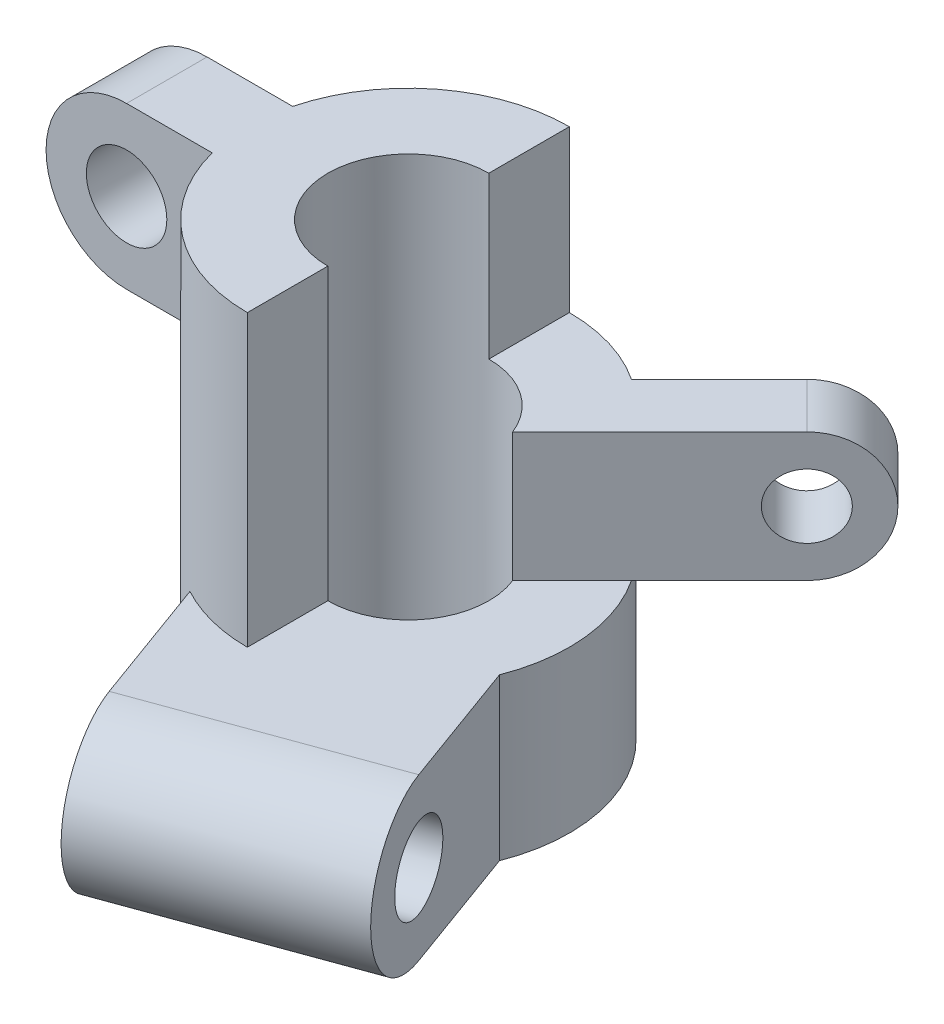
ISO-10303-21;
HEADER;
FILE_DESCRIPTION(('STEP AP214'),'2;1');
FILE_NAME('part.step','',(''),(''),'','','');
FILE_SCHEMA(('AUTOMOTIVE_DESIGN { 1 0 10303 214 1 1 1 1 }'));
ENDSEC;
DATA;
#1=APPLICATION_CONTEXT('core data for automotive mechanical design processes');
#2=APPLICATION_PROTOCOL_DEFINITION('international standard','automotive_design',2000,#1);
#3=PRODUCT_CONTEXT('',#1,'mechanical');
#4=PRODUCT('Part','Part','',(#3));
#5=PRODUCT_RELATED_PRODUCT_CATEGORY('part','',(#4));
#6=PRODUCT_DEFINITION_FORMATION('','',#4);
#7=PRODUCT_DEFINITION_CONTEXT('part definition',#1,'design');
#8=PRODUCT_DEFINITION('design','',#6,#7);
#9=PRODUCT_DEFINITION_SHAPE('','',#8);
#10=(LENGTH_UNIT() NAMED_UNIT(*) SI_UNIT(.MILLI.,.METRE.));
#11=(NAMED_UNIT(*) PLANE_ANGLE_UNIT() SI_UNIT($,.RADIAN.));
#12=(NAMED_UNIT(*) SI_UNIT($,.STERADIAN.) SOLID_ANGLE_UNIT());
#13=UNCERTAINTY_MEASURE_WITH_UNIT(LENGTH_MEASURE(1.E-05),#10,'distance_accuracy_value','');
#14=(GEOMETRIC_REPRESENTATION_CONTEXT(3) GLOBAL_UNCERTAINTY_ASSIGNED_CONTEXT((#13)) GLOBAL_UNIT_ASSIGNED_CONTEXT((#10,
#11,#12)) REPRESENTATION_CONTEXT('',''));
#15=CARTESIAN_POINT('',(0.,0.,0.));
#16=DIRECTION('',(0.,0.,1.));
#17=DIRECTION('',(1.,0.,0.));
#18=AXIS2_PLACEMENT_3D('',#15,#16,#17);
#19=CARTESIAN_POINT('',(-35.2365437483666,10.,44.7503862571017));
#20=DIRECTION('',(0.939692620785908,0.,-0.34202014332567));
#21=DIRECTION('',(-0.34202014332567,0.,-0.939692620785908));
#22=AXIS2_PLACEMENT_3D('',#19,#20,#21);
#23=CYLINDRICAL_SURFACE('',#22,4.99999999999999);
#24=CARTESIAN_POINT('',(24.3559936115587,10.,23.0604764736922));
#25=DIRECTION('',(0.939692620785908,0.,-0.342020143325669));
#26=DIRECTION('',(-0.342020143325669,0.,-0.939692620785908));
#27=AXIS2_PLACEMENT_3D('',#24,#25,#26);
#28=CIRCLE('',#27,4.99999999999999);
#29=CARTESIAN_POINT('',(22.6458928949304,10.,18.3620133697627));
#30=VERTEX_POINT('',#29);
#31=EDGE_CURVE('E293',#30,#30,#28,.T.);
#32=ORIENTED_EDGE('',*,*,#31,.T.);
#33=EDGE_LOOP('',(#32));
#34=FACE_BOUND('',#33,.T.);
#35=CARTESIAN_POINT('',(-3.83478501201853,10.,33.3210807734623));
#36=DIRECTION('',(0.939692620785908,0.,-0.34202014332567));
#37=DIRECTION('',(-0.34202014332567,0.,-0.939692620785908));
#38=AXIS2_PLACEMENT_3D('',#35,#36,#37);
#39=CIRCLE('',#38,4.99999999999999);
#40=CARTESIAN_POINT('',(-5.54488572864688,10.,28.6226176695327));
#41=VERTEX_POINT('',#40);
#42=EDGE_CURVE('E300',#41,#41,#39,.F.);
#43=ORIENTED_EDGE('',*,*,#42,.T.);
#44=EDGE_LOOP('',(#43));
#45=FACE_BOUND('',#44,.T.);
#46=ADVANCED_FACE('F45',(#34,#45),#23,.F.);
#47=CARTESIAN_POINT('',(-35.2365437483666,10.,44.7503862571017));
#48=DIRECTION('',(0.939692620785908,0.,-0.34202014332567));
#49=DIRECTION('',(-0.34202014332567,0.,-0.939692620785908));
#50=AXIS2_PLACEMENT_3D('',#47,#48,#49);
#51=CYLINDRICAL_SURFACE('',#50,10.);
#52=CARTESIAN_POINT('',(-3.83478501201853,10.,33.3210807734623));
#53=DIRECTION('',(0.939692620785908,0.,-0.34202014332567));
#54=DIRECTION('',(-0.34202014332567,0.,-0.939692620785908));
#55=AXIS2_PLACEMENT_3D('',#52,#53,#54);
#56=CIRCLE('',#55,10.);
#57=CARTESIAN_POINT('',(-3.83478501201853,0.,33.3210807734623));
#58=VERTEX_POINT('',#57);
#59=CARTESIAN_POINT('',(-3.83478501201853,20.,33.3210807734623));
#60=VERTEX_POINT('',#59);
#61=EDGE_CURVE('E287',#58,#60,#56,.F.);
#62=ORIENTED_EDGE('',*,*,#61,.F.);
#63=DIRECTION('',(0.939692620785908,0.,-0.34202014332567));
#64=VECTOR('',#63,1.);
#65=CARTESIAN_POINT('',(-35.2365437483666,0.,44.7503862571017));
#66=LINE('',#65,#64);
#67=CARTESIAN_POINT('',(24.3559936115587,0.,23.0604764736922));
#68=VERTEX_POINT('',#67);
#69=EDGE_CURVE('E319',#58,#68,#66,.T.);
#70=ORIENTED_EDGE('',*,*,#69,.T.);
#71=CARTESIAN_POINT('',(24.3559936115587,10.,23.0604764736922));
#72=DIRECTION('',(0.939692620785908,0.,-0.342020143325669));
#73=DIRECTION('',(-0.342020143325669,0.,-0.939692620785908));
#74=AXIS2_PLACEMENT_3D('',#71,#72,#73);
#75=CIRCLE('',#74,10.);
#76=CARTESIAN_POINT('',(24.3559936115587,20.,23.0604764736922));
#77=VERTEX_POINT('',#76);
#78=EDGE_CURVE('E291',#77,#68,#75,.T.);
#79=ORIENTED_EDGE('',*,*,#78,.F.);
#80=DIRECTION('',(0.939692620785908,0.,-0.34202014332567));
#81=VECTOR('',#80,1.);
#82=CARTESIAN_POINT('',(-35.2365437483666,20.,44.7503862571017));
#83=LINE('',#82,#81);
#84=EDGE_CURVE('E292',#60,#77,#83,.T.);
#85=ORIENTED_EDGE('',*,*,#84,.F.);
#86=EDGE_LOOP('',(#62,#70,#79,#85));
#87=FACE_BOUND('',#86,.T.);
#88=ADVANCED_FACE('F390',(#87),#51,.T.);
#89=CARTESIAN_POINT('',(5.9203102167829,28.,-43.5771644662754));
#90=DIRECTION('',(0.707106781186549,0.,0.707106781186546));
#91=DIRECTION('',(0.707106781186546,0.,-0.707106781186549));
#92=AXIS2_PLACEMENT_3D('',#89,#90,#91);
#93=CYLINDRICAL_SURFACE('',#92,4.);
#94=CARTESIAN_POINT('',(27.5771644662753,28.,-21.920310216783));
#95=DIRECTION('',(0.707106781186549,0.,0.707106781186546));
#96=DIRECTION('',(0.707106781186546,0.,-0.707106781186549));
#97=AXIS2_PLACEMENT_3D('',#94,#95,#96);
#98=CIRCLE('',#97,4.);
#99=CARTESIAN_POINT('',(30.4055915910215,28.,-24.7487373415292));
#100=VERTEX_POINT('',#99);
#101=EDGE_CURVE('E199',#100,#100,#98,.T.);
#102=ORIENTED_EDGE('',*,*,#101,.T.);
#103=EDGE_LOOP('',(#102));
#104=FACE_BOUND('',#103,.T.);
#105=CARTESIAN_POINT('',(21.9203102167829,28.,-27.5771644662754));
#106=DIRECTION('',(0.707106781186549,0.,0.707106781186546));
#107=DIRECTION('',(0.707106781186546,0.,-0.707106781186549));
#108=AXIS2_PLACEMENT_3D('',#105,#106,#107);
#109=CIRCLE('',#108,4.);
#110=CARTESIAN_POINT('',(24.7487373415291,28.,-30.4055915910216));
#111=VERTEX_POINT('',#110);
#112=EDGE_CURVE('E207',#111,#111,#109,.F.);
#113=ORIENTED_EDGE('',*,*,#112,.T.);
#114=EDGE_LOOP('',(#113));
#115=FACE_BOUND('',#114,.T.);
#116=ADVANCED_FACE('F396',(#104,#115),#93,.F.);
#117=CARTESIAN_POINT('',(5.9203102167829,28.,-43.5771644662754));
#118=DIRECTION('',(0.707106781186549,0.,0.707106781186546));
#119=DIRECTION('',(0.707106781186546,0.,-0.707106781186549));
#120=AXIS2_PLACEMENT_3D('',#117,#118,#119);
#121=CYLINDRICAL_SURFACE('',#120,7.99999999999999);
#122=DIRECTION('',(0.707106781186549,0.,0.707106781186546));
#123=VECTOR('',#122,1.);
#124=CARTESIAN_POINT('',(5.9203102167829,20.,-43.5771644662754));
#125=LINE('',#124,#123);
#126=CARTESIAN_POINT('',(21.9203102167829,20.,-27.5771644662754));
#127=VERTEX_POINT('',#126);
#128=CARTESIAN_POINT('',(27.5771644662753,20.,-21.920310216783));
#129=VERTEX_POINT('',#128);
#130=EDGE_CURVE('E86',#127,#129,#125,.T.);
#131=ORIENTED_EDGE('',*,*,#130,.F.);
#132=CARTESIAN_POINT('',(21.9203102167829,28.,-27.5771644662754));
#133=DIRECTION('',(0.707106781186549,0.,0.707106781186546));
#134=DIRECTION('',(0.707106781186546,0.,-0.707106781186549));
#135=AXIS2_PLACEMENT_3D('',#132,#133,#134);
#136=CIRCLE('',#135,7.99999999999999);
#137=CARTESIAN_POINT('',(21.9203102167829,36.,-27.5771644662754));
#138=VERTEX_POINT('',#137);
#139=EDGE_CURVE('E203',#138,#127,#136,.F.);
#140=ORIENTED_EDGE('',*,*,#139,.F.);
#141=DIRECTION('',(0.707106781186549,0.,0.707106781186546));
#142=VECTOR('',#141,1.);
#143=CARTESIAN_POINT('',(5.9203102167829,36.,-43.5771644662754));
#144=LINE('',#143,#142);
#145=CARTESIAN_POINT('',(27.5771644662753,36.,-21.920310216783));
#146=VERTEX_POINT('',#145);
#147=EDGE_CURVE('E212',#138,#146,#144,.T.);
#148=ORIENTED_EDGE('',*,*,#147,.T.);
#149=CARTESIAN_POINT('',(27.5771644662753,28.,-21.920310216783));
#150=DIRECTION('',(0.707106781186549,0.,0.707106781186546));
#151=DIRECTION('',(0.707106781186546,0.,-0.707106781186549));
#152=AXIS2_PLACEMENT_3D('',#149,#150,#151);
#153=CIRCLE('',#152,7.99999999999999);
#154=EDGE_CURVE('E208',#129,#146,#153,.T.);
#155=ORIENTED_EDGE('',*,*,#154,.F.);
#156=EDGE_LOOP('',(#131,#140,#148,#155));
#157=FACE_BOUND('',#156,.T.);
#158=ADVANCED_FACE('F431',(#157),#121,.T.);
#159=CARTESIAN_POINT('',(2.82842712474619,-11.4040820577346,2.82842712474618));
#160=DIRECTION('',(-0.707106781186549,0.,-0.707106781186546));
#161=DIRECTION('',(-0.707106781186546,0.,0.707106781186549));
#162=AXIS2_PLACEMENT_3D('',#159,#160,#161);
#163=PLANE('',#162);
#164=DIRECTION('',(0.707106781186546,0.,-0.707106781186549));
#165=VECTOR('',#164,1.);
#166=CARTESIAN_POINT('',(2.82842712474619,20.,2.82842712474618));
#167=LINE('',#166,#165);
#168=CARTESIAN_POINT('',(16.6848335852972,20.,-11.0279793358049));
#169=VERTEX_POINT('',#168);
#170=EDGE_CURVE('E342',#169,#129,#167,.T.);
#171=ORIENTED_EDGE('',*,*,#170,.T.);
#172=ORIENTED_EDGE('',*,*,#154,.T.);
#173=DIRECTION('',(-0.707106781186546,0.,0.707106781186549));
#174=VECTOR('',#173,1.);
#175=CARTESIAN_POINT('',(2.82842712474619,36.,2.82842712474618));
#176=LINE('',#175,#174);
#177=CARTESIAN_POINT('',(9.30916782315401,36.,-3.65231357366176));
#178=VERTEX_POINT('',#177);
#179=EDGE_CURVE('E78',#146,#178,#176,.T.);
#180=ORIENTED_EDGE('',*,*,#179,.T.);
#181=DIRECTION('',(0.,1.,0.));
#182=VECTOR('',#181,1.);
#183=CARTESIAN_POINT('',(9.30916782315401,5.9804420900418,-3.65231357366176));
#184=LINE('',#183,#182);
#185=CARTESIAN_POINT('',(9.30916782315401,20.,-3.65231357366176));
#186=VERTEX_POINT('',#185);
#187=EDGE_CURVE('E332',#186,#178,#184,.T.);
#188=ORIENTED_EDGE('',*,*,#187,.F.);
#189=DIRECTION('',(-0.707106781186551,0.,0.707106781186544));
#190=VECTOR('',#189,1.);
#191=CARTESIAN_POINT('',(16.6848335852972,20.,-11.0279793358049));
#192=LINE('',#191,#190);
#193=EDGE_CURVE('E336',#169,#186,#192,.T.);
#194=ORIENTED_EDGE('',*,*,#193,.F.);
#195=EDGE_LOOP('',(#171,#172,#180,#188,#194));
#196=FACE_BOUND('',#195,.T.);
#197=ORIENTED_EDGE('',*,*,#101,.F.);
#198=EDGE_LOOP('',(#197));
#199=FACE_BOUND('',#198,.T.);
#200=ADVANCED_FACE('F407',(#196,#199),#163,.F.);
#201=CARTESIAN_POINT('',(-9.57088809871668,71.4703107674958,17.5612670670952));
#202=DIRECTION('',(0.939692620785908,0.,-0.34202014332567));
#203=DIRECTION('',(-0.34202014332567,0.,-0.939692620785908));
#204=AXIS2_PLACEMENT_3D('',#201,#202,#203);
#205=PLANE('',#204);
#206=DIRECTION('',(0.34202014332567,0.,0.939692620785908));
#207=VECTOR('',#206,1.);
#208=CARTESIAN_POINT('',(-9.57088809871668,0.,17.5612670670952));
#209=LINE('',#208,#207);
#210=CARTESIAN_POINT('',(-9.57088809871668,0.,17.5612670670952));
#211=VERTEX_POINT('',#210);
#212=EDGE_CURVE('E306',#211,#58,#209,.T.);
#213=ORIENTED_EDGE('',*,*,#212,.T.);
#214=ORIENTED_EDGE('',*,*,#61,.T.);
#215=DIRECTION('',(0.34202014332567,0.,0.939692620785908));
#216=VECTOR('',#215,1.);
#217=CARTESIAN_POINT('',(-9.57088809871668,20.,17.5612670670952));
#218=LINE('',#217,#216);
#219=CARTESIAN_POINT('',(-9.57088809871668,20.,17.5612670670952));
#220=VERTEX_POINT('',#219);
#221=EDGE_CURVE('E313',#220,#60,#218,.T.);
#222=ORIENTED_EDGE('',*,*,#221,.F.);
#223=DIRECTION('',(0.,-1.,0.));
#224=VECTOR('',#223,1.);
#225=CARTESIAN_POINT('',(-9.57088809871668,71.4703107674958,17.5612670670952));
#226=LINE('',#225,#224);
#227=EDGE_CURVE('E286',#220,#211,#226,.T.);
#228=ORIENTED_EDGE('',*,*,#227,.T.);
#229=EDGE_LOOP('',(#213,#214,#222,#228));
#230=FACE_BOUND('',#229,.T.);
#231=ORIENTED_EDGE('',*,*,#42,.F.);
#232=EDGE_LOOP('',(#231));
#233=FACE_BOUND('',#232,.T.);
#234=ADVANCED_FACE('F403',(#230,#233),#205,.F.);
#235=CARTESIAN_POINT('',(0.,0.,0.));
#236=DIRECTION('',(0.,1.,0.));
#237=DIRECTION('',(0.,0.,1.));
#238=AXIS2_PLACEMENT_3D('',#235,#236,#237);
#239=PLANE('',#238);
#240=CARTESIAN_POINT('',(0.,0.,0.));
#241=DIRECTION('',(0.,1.,0.));
#242=DIRECTION('',(0.,0.,1.));
#243=AXIS2_PLACEMENT_3D('',#240,#241,#242);
#244=CIRCLE('',#243,10.);
#245=CARTESIAN_POINT('',(0.,0.,10.));
#246=VERTEX_POINT('',#245);
#247=EDGE_CURVE('E240',#246,#246,#244,.T.);
#248=ORIENTED_EDGE('',*,*,#247,.T.);
#249=EDGE_LOOP('',(#248));
#250=FACE_BOUND('',#249,.T.);
#251=CARTESIAN_POINT('',(0.,0.,0.));
#252=DIRECTION('',(0.,1.,0.));
#253=DIRECTION('',(0.,0.,1.));
#254=AXIS2_PLACEMENT_3D('',#251,#252,#253);
#255=CIRCLE('',#254,20.);
#256=CARTESIAN_POINT('',(18.6198905248606,0.,7.30066276732515));
#257=VERTEX_POINT('',#256);
#258=EDGE_CURVE('E231',#257,#211,#255,.T.);
#259=ORIENTED_EDGE('',*,*,#258,.F.);
#260=DIRECTION('',(-0.342020143325669,0.,-0.939692620785908));
#261=VECTOR('',#260,1.);
#262=CARTESIAN_POINT('',(18.6198905248606,0.,7.30066276732515));
#263=LINE('',#262,#261);
#264=EDGE_CURVE('E309',#68,#257,#263,.T.);
#265=ORIENTED_EDGE('',*,*,#264,.F.);
#266=ORIENTED_EDGE('',*,*,#69,.F.);
#267=ORIENTED_EDGE('',*,*,#212,.F.);
#268=EDGE_LOOP('',(#259,#265,#266,#267));
#269=FACE_BOUND('',#268,.T.);
#270=ADVANCED_FACE('F406',(#250,#269),#239,.F.);
#271=CARTESIAN_POINT('',(18.6198905248606,71.4703107674958,7.30066276732515));
#272=DIRECTION('',(-0.939692620785908,0.,0.342020143325669));
#273=DIRECTION('',(0.342020143325669,0.,0.939692620785908));
#274=AXIS2_PLACEMENT_3D('',#271,#272,#273);
#275=PLANE('',#274);
#276=DIRECTION('',(-0.342020143325669,0.,-0.939692620785908));
#277=VECTOR('',#276,1.);
#278=CARTESIAN_POINT('',(18.6198905248606,20.,7.30066276732515));
#279=LINE('',#278,#277);
#280=CARTESIAN_POINT('',(18.6198905248606,20.,7.30066276732515));
#281=VERTEX_POINT('',#280);
#282=EDGE_CURVE('E305',#77,#281,#279,.T.);
#283=ORIENTED_EDGE('',*,*,#282,.F.);
#284=ORIENTED_EDGE('',*,*,#78,.T.);
#285=ORIENTED_EDGE('',*,*,#264,.T.);
#286=DIRECTION('',(0.,-1.,0.));
#287=VECTOR('',#286,1.);
#288=CARTESIAN_POINT('',(18.6198905248606,71.4703107674958,7.30066276732515));
#289=LINE('',#288,#287);
#290=EDGE_CURVE('E282',#281,#257,#289,.T.);
#291=ORIENTED_EDGE('',*,*,#290,.F.);
#292=EDGE_LOOP('',(#283,#284,#285,#291));
#293=FACE_BOUND('',#292,.T.);
#294=ORIENTED_EDGE('',*,*,#31,.F.);
#295=EDGE_LOOP('',(#294));
#296=FACE_BOUND('',#295,.T.);
#297=ADVANCED_FACE('F409',(#293,#296),#275,.F.);
#298=CARTESIAN_POINT('',(0.,20.,0.));
#299=DIRECTION('',(0.,1.,0.));
#300=DIRECTION('',(0.,0.,1.));
#301=AXIS2_PLACEMENT_3D('',#298,#299,#300);
#302=PLANE('',#301);
#303=ORIENTED_EDGE('',*,*,#193,.T.);
#304=CARTESIAN_POINT('',(0.,20.,0.));
#305=DIRECTION('',(0.,1.,0.));
#306=DIRECTION('',(0.,0.,1.));
#307=AXIS2_PLACEMENT_3D('',#304,#305,#306);
#308=CIRCLE('',#307,10.);
#309=CARTESIAN_POINT('',(0.,20.,10.));
#310=VERTEX_POINT('',#309);
#311=EDGE_CURVE('E272',#310,#186,#308,.T.);
#312=ORIENTED_EDGE('',*,*,#311,.F.);
#313=DIRECTION('',(0.,0.,-1.));
#314=VECTOR('',#313,1.);
#315=CARTESIAN_POINT('',(0.,20.,0.));
#316=LINE('',#315,#314);
#317=CARTESIAN_POINT('',(0.,20.,20.));
#318=VERTEX_POINT('',#317);
#319=EDGE_CURVE('E252',#318,#310,#316,.T.);
#320=ORIENTED_EDGE('',*,*,#319,.F.);
#321=CARTESIAN_POINT('',(0.,20.,0.));
#322=DIRECTION('',(0.,1.,0.));
#323=DIRECTION('',(0.,0.,1.));
#324=AXIS2_PLACEMENT_3D('',#321,#322,#323);
#325=CIRCLE('',#324,20.);
#326=EDGE_CURVE('E276',#220,#318,#325,.T.);
#327=ORIENTED_EDGE('',*,*,#326,.F.);
#328=ORIENTED_EDGE('',*,*,#221,.T.);
#329=ORIENTED_EDGE('',*,*,#84,.T.);
#330=ORIENTED_EDGE('',*,*,#282,.T.);
#331=CARTESIAN_POINT('',(0.,20.,0.));
#332=DIRECTION('',(0.,1.,0.));
#333=DIRECTION('',(0.,0.,1.));
#334=AXIS2_PLACEMENT_3D('',#331,#332,#333);
#335=CIRCLE('',#334,20.);
#336=EDGE_CURVE('E267',#281,#169,#335,.T.);
#337=ORIENTED_EDGE('',*,*,#336,.T.);
#338=EDGE_LOOP('',(#303,#312,#320,#327,#328,#329,#330,#337));
#339=FACE_BOUND('',#338,.T.);
#340=ADVANCED_FACE('F412',(#339),#302,.T.);
#341=CARTESIAN_POINT('',(0.,20.,0.));
#342=DIRECTION('',(0.,1.,0.));
#343=DIRECTION('',(0.,0.,1.));
#344=AXIS2_PLACEMENT_3D('',#341,#342,#343);
#345=PLANE('',#344);
#346=DIRECTION('',(-0.707106781186546,0.,0.707106781186549));
#347=VECTOR('',#346,1.);
#348=CARTESIAN_POINT('',(-2.82842712474619,20.,-2.82842712474618));
#349=LINE('',#348,#347);
#350=CARTESIAN_POINT('',(11.0279793358048,20.,-16.6848335852972));
#351=VERTEX_POINT('',#350);
#352=EDGE_CURVE('E327',#127,#351,#349,.T.);
#353=ORIENTED_EDGE('',*,*,#352,.F.);
#354=ORIENTED_EDGE('',*,*,#130,.T.);
#355=ORIENTED_EDGE('',*,*,#170,.F.);
#356=EDGE_CURVE('E271',#169,#351,#335,.T.);
#357=ORIENTED_EDGE('',*,*,#356,.T.);
#358=EDGE_LOOP('',(#353,#354,#355,#357));
#359=FACE_BOUND('',#358,.T.);
#360=ADVANCED_FACE('F415',(#359),#345,.F.);
#361=CARTESIAN_POINT('',(-2.82842712474619,-11.4040820577346,-2.82842712474618));
#362=DIRECTION('',(0.707106781186549,0.,0.707106781186546));
#363=DIRECTION('',(0.707106781186546,0.,-0.707106781186549));
#364=AXIS2_PLACEMENT_3D('',#361,#362,#363);
#365=PLANE('',#364);
#366=DIRECTION('',(0.707106781186546,0.,-0.707106781186549));
#367=VECTOR('',#366,1.);
#368=CARTESIAN_POINT('',(-2.82842712474619,36.,-2.82842712474618));
#369=LINE('',#368,#367);
#370=CARTESIAN_POINT('',(11.0279793358048,36.,-16.6848335852972));
#371=VERTEX_POINT('',#370);
#372=EDGE_CURVE('E328',#371,#138,#369,.T.);
#373=ORIENTED_EDGE('',*,*,#372,.T.);
#374=ORIENTED_EDGE('',*,*,#139,.T.);
#375=ORIENTED_EDGE('',*,*,#352,.T.);
#376=DIRECTION('',(0.,1.,0.));
#377=VECTOR('',#376,1.);
#378=CARTESIAN_POINT('',(11.0279793358048,-11.4040820577346,-16.6848335852972));
#379=LINE('',#378,#377);
#380=EDGE_CURVE('E323',#351,#371,#379,.T.);
#381=ORIENTED_EDGE('',*,*,#380,.T.);
#382=EDGE_LOOP('',(#373,#374,#375,#381));
#383=FACE_BOUND('',#382,.T.);
#384=ORIENTED_EDGE('',*,*,#112,.F.);
#385=EDGE_LOOP('',(#384));
#386=FACE_BOUND('',#385,.T.);
#387=ADVANCED_FACE('F423',(#383,#386),#365,.F.);
#388=CARTESIAN_POINT('',(0.,36.,0.));
#389=DIRECTION('',(0.,1.,0.));
#390=DIRECTION('',(0.,0.,1.));
#391=AXIS2_PLACEMENT_3D('',#388,#389,#390);
#392=PLANE('',#391);
#393=ORIENTED_EDGE('',*,*,#147,.F.);
#394=ORIENTED_EDGE('',*,*,#372,.F.);
#395=CARTESIAN_POINT('',(0.,36.,0.));
#396=DIRECTION('',(0.,1.,0.));
#397=DIRECTION('',(0.,0.,1.));
#398=AXIS2_PLACEMENT_3D('',#395,#396,#397);
#399=CIRCLE('',#398,20.);
#400=CARTESIAN_POINT('',(0.,36.,-20.));
#401=VERTEX_POINT('',#400);
#402=EDGE_CURVE('E248',#371,#401,#399,.T.);
#403=ORIENTED_EDGE('',*,*,#402,.T.);
#404=DIRECTION('',(0.,0.,1.));
#405=VECTOR('',#404,1.);
#406=CARTESIAN_POINT('',(0.,36.,-20.));
#407=LINE('',#406,#405);
#408=CARTESIAN_POINT('',(0.,36.,-10.));
#409=VERTEX_POINT('',#408);
#410=EDGE_CURVE('E251',#401,#409,#407,.T.);
#411=ORIENTED_EDGE('',*,*,#410,.T.);
#412=CARTESIAN_POINT('',(0.,36.,0.));
#413=DIRECTION('',(0.,1.,0.));
#414=DIRECTION('',(0.,0.,1.));
#415=AXIS2_PLACEMENT_3D('',#412,#413,#414);
#416=CIRCLE('',#415,10.);
#417=EDGE_CURVE('E227',#178,#409,#416,.T.);
#418=ORIENTED_EDGE('',*,*,#417,.F.);
#419=ORIENTED_EDGE('',*,*,#179,.F.);
#420=EDGE_LOOP('',(#393,#394,#403,#411,#418,#419));
#421=FACE_BOUND('',#420,.T.);
#422=ADVANCED_FACE('F419',(#421),#392,.T.);
#423=CARTESIAN_POINT('',(0.,155.498743710662,-20.));
#424=DIRECTION('',(1.,0.,0.));
#425=DIRECTION('',(0.,0.,-1.));
#426=AXIS2_PLACEMENT_3D('',#423,#424,#425);
#427=PLANE('',#426);
#428=DIRECTION('',(0.,-1.,0.));
#429=VECTOR('',#428,1.);
#430=CARTESIAN_POINT('',(0.,56.,-10.));
#431=LINE('',#430,#429);
#432=CARTESIAN_POINT('',(0.,56.,-10.));
#433=VERTEX_POINT('',#432);
#434=EDGE_CURVE('E223',#409,#433,#431,.F.);
#435=ORIENTED_EDGE('',*,*,#434,.F.);
#436=ORIENTED_EDGE('',*,*,#410,.F.);
#437=DIRECTION('',(0.,-1.,0.));
#438=VECTOR('',#437,1.);
#439=CARTESIAN_POINT('',(0.,155.498743710662,-20.));
#440=LINE('',#439,#438);
#441=CARTESIAN_POINT('',(0.,56.,-20.));
#442=VERTEX_POINT('',#441);
#443=EDGE_CURVE('E256',#442,#401,#440,.T.);
#444=ORIENTED_EDGE('',*,*,#443,.F.);
#445=DIRECTION('',(0.,0.,1.));
#446=VECTOR('',#445,1.);
#447=CARTESIAN_POINT('',(0.,56.,-20.));
#448=LINE('',#447,#446);
#449=EDGE_CURVE('E244',#442,#433,#448,.T.);
#450=ORIENTED_EDGE('',*,*,#449,.T.);
#451=EDGE_LOOP('',(#435,#436,#444,#450));
#452=FACE_BOUND('',#451,.T.);
#453=ADVANCED_FACE('F385',(#452),#427,.T.);
#454=CARTESIAN_POINT('',(0.,56.,0.));
#455=DIRECTION('',(0.,-1.,0.));
#456=DIRECTION('',(0.,0.,-1.));
#457=AXIS2_PLACEMENT_3D('',#454,#455,#456);
#458=CYLINDRICAL_SURFACE('',#457,10.);
#459=ORIENTED_EDGE('',*,*,#187,.T.);
#460=ORIENTED_EDGE('',*,*,#417,.T.);
#461=ORIENTED_EDGE('',*,*,#434,.T.);
#462=CARTESIAN_POINT('',(0.,56.,0.));
#463=DIRECTION('',(0.,1.,0.));
#464=DIRECTION('',(0.,0.,1.));
#465=AXIS2_PLACEMENT_3D('',#462,#463,#464);
#466=CIRCLE('',#465,10.);
#467=CARTESIAN_POINT('',(0.,56.,10.));
#468=VERTEX_POINT('',#467);
#469=EDGE_CURVE('E236',#433,#468,#466,.T.);
#470=ORIENTED_EDGE('',*,*,#469,.T.);
#471=DIRECTION('',(0.,-1.,0.));
#472=VECTOR('',#471,1.);
#473=CARTESIAN_POINT('',(0.,56.,10.));
#474=LINE('',#473,#472);
#475=EDGE_CURVE('E219',#468,#310,#474,.T.);
#476=ORIENTED_EDGE('',*,*,#475,.T.);
#477=ORIENTED_EDGE('',*,*,#311,.T.);
#478=EDGE_LOOP('',(#459,#460,#461,#470,#476,#477));
#479=FACE_BOUND('',#478,.T.);
#480=ORIENTED_EDGE('',*,*,#247,.F.);
#481=EDGE_LOOP('',(#480));
#482=FACE_BOUND('',#481,.T.);
#483=ADVANCED_FACE('F382',(#479,#482),#458,.F.);
#484=ORIENTED_EDGE('',*,*,#475,.F.);
#485=CARTESIAN_POINT('',(0.,56.,20.));
#486=VERTEX_POINT('',#485);
#487=EDGE_CURVE('E255',#468,#486,#448,.T.);
#488=ORIENTED_EDGE('',*,*,#487,.T.);
#489=DIRECTION('',(0.,-1.,0.));
#490=VECTOR('',#489,1.);
#491=CARTESIAN_POINT('',(0.,155.498743710662,20.));
#492=LINE('',#491,#490);
#493=EDGE_CURVE('E260',#486,#318,#492,.T.);
#494=ORIENTED_EDGE('',*,*,#493,.T.);
#495=ORIENTED_EDGE('',*,*,#319,.T.);
#496=EDGE_LOOP('',(#484,#488,#494,#495));
#497=FACE_BOUND('',#496,.T.);
#498=ADVANCED_FACE('F373',(#497),#427,.T.);
#499=CARTESIAN_POINT('',(-19.3649167310371,36.,5.));
#500=DIRECTION('',(0.,0.,1.));
#501=DIRECTION('',(1.,0.,0.));
#502=AXIS2_PLACEMENT_3D('',#499,#500,#501);
#503=PLANE('',#502);
#504=DIRECTION('',(1.,0.,0.));
#505=VECTOR('',#504,1.);
#506=CARTESIAN_POINT('',(-19.3649167310371,56.,5.));
#507=LINE('',#506,#505);
#508=CARTESIAN_POINT('',(-30.,56.,5.));
#509=VERTEX_POINT('',#508);
#510=CARTESIAN_POINT('',(-19.3649167310371,56.,4.99999999999998));
#511=VERTEX_POINT('',#510);
#512=EDGE_CURVE('E56',#509,#511,#507,.T.);
#513=ORIENTED_EDGE('',*,*,#512,.F.);
#514=CARTESIAN_POINT('',(-30.,46.,4.99999999999999));
#515=DIRECTION('',(0.,0.,1.));
#516=DIRECTION('',(1.,0.,0.));
#517=AXIS2_PLACEMENT_3D('',#514,#515,#516);
#518=CIRCLE('',#517,10.);
#519=CARTESIAN_POINT('',(-30.,36.,4.99999999999999));
#520=VERTEX_POINT('',#519);
#521=EDGE_CURVE('E187',#509,#520,#518,.T.);
#522=ORIENTED_EDGE('',*,*,#521,.T.);
#523=DIRECTION('',(1.,0.,0.));
#524=VECTOR('',#523,1.);
#525=CARTESIAN_POINT('',(-19.3649167310371,36.,5.));
#526=LINE('',#525,#524);
#527=CARTESIAN_POINT('',(-19.3649167310371,36.,5.));
#528=VERTEX_POINT('',#527);
#529=EDGE_CURVE('E185',#520,#528,#526,.T.);
#530=ORIENTED_EDGE('',*,*,#529,.T.);
#531=DIRECTION('',(0.,1.,0.));
#532=VECTOR('',#531,1.);
#533=CARTESIAN_POINT('',(-19.3649167310371,36.,5.));
#534=LINE('',#533,#532);
#535=EDGE_CURVE('E194',#528,#511,#534,.T.);
#536=ORIENTED_EDGE('',*,*,#535,.T.);
#537=EDGE_LOOP('',(#513,#522,#530,#536));
#538=FACE_BOUND('',#537,.T.);
#539=CARTESIAN_POINT('',(-30.,46.,4.99999999999999));
#540=DIRECTION('',(0.,0.,1.));
#541=DIRECTION('',(1.,0.,0.));
#542=AXIS2_PLACEMENT_3D('',#539,#540,#541);
#543=CIRCLE('',#542,5.);
#544=CARTESIAN_POINT('',(-25.,46.,4.99999999999999));
#545=VERTEX_POINT('',#544);
#546=EDGE_CURVE('E177',#545,#545,#543,.T.);
#547=ORIENTED_EDGE('',*,*,#546,.F.);
#548=EDGE_LOOP('',(#547));
#549=FACE_BOUND('',#548,.T.);
#550=ADVANCED_FACE('F370',(#538,#549),#503,.T.);
#551=CARTESIAN_POINT('',(0.,56.,0.));
#552=DIRECTION('',(0.,-1.,0.));
#553=DIRECTION('',(0.,0.,-1.));
#554=AXIS2_PLACEMENT_3D('',#551,#552,#553);
#555=CYLINDRICAL_SURFACE('',#554,20.);
#556=CARTESIAN_POINT('',(0.,36.,0.));
#557=DIRECTION('',(0.,1.,0.));
#558=DIRECTION('',(0.,0.,1.));
#559=AXIS2_PLACEMENT_3D('',#556,#557,#558);
#560=CIRCLE('',#559,20.);
#561=CARTESIAN_POINT('',(-19.3649167310371,36.,-5.));
#562=VERTEX_POINT('',#561);
#563=EDGE_CURVE('E337',#562,#528,#560,.T.);
#564=ORIENTED_EDGE('',*,*,#563,.F.);
#565=DIRECTION('',(0.,1.,0.));
#566=VECTOR('',#565,1.);
#567=CARTESIAN_POINT('',(-19.3649167310371,36.,-5.));
#568=LINE('',#567,#566);
#569=CARTESIAN_POINT('',(-19.3649167310371,56.,-5.));
#570=VERTEX_POINT('',#569);
#571=EDGE_CURVE('E70',#562,#570,#568,.T.);
#572=ORIENTED_EDGE('',*,*,#571,.T.);
#573=CARTESIAN_POINT('',(0.,56.,0.));
#574=DIRECTION('',(0.,1.,0.));
#575=DIRECTION('',(0.,0.,1.));
#576=AXIS2_PLACEMENT_3D('',#573,#574,#575);
#577=CIRCLE('',#576,20.);
#578=EDGE_CURVE('E235',#442,#570,#577,.T.);
#579=ORIENTED_EDGE('',*,*,#578,.F.);
#580=ORIENTED_EDGE('',*,*,#443,.T.);
#581=ORIENTED_EDGE('',*,*,#402,.F.);
#582=ORIENTED_EDGE('',*,*,#380,.F.);
#583=ORIENTED_EDGE('',*,*,#356,.F.);
#584=ORIENTED_EDGE('',*,*,#336,.F.);
#585=ORIENTED_EDGE('',*,*,#290,.T.);
#586=ORIENTED_EDGE('',*,*,#258,.T.);
#587=ORIENTED_EDGE('',*,*,#227,.F.);
#588=ORIENTED_EDGE('',*,*,#326,.T.);
#589=ORIENTED_EDGE('',*,*,#493,.F.);
#590=EDGE_CURVE('E230',#511,#486,#577,.T.);
#591=ORIENTED_EDGE('',*,*,#590,.F.);
#592=ORIENTED_EDGE('',*,*,#535,.F.);
#593=EDGE_LOOP('',(#564,#572,#579,#580,#581,#582,#583,#584,#585,#586,#587,#588,#589,#591,#592));
#594=FACE_BOUND('',#593,.T.);
#595=ADVANCED_FACE('F372',(#594),#555,.T.);
#596=CARTESIAN_POINT('',(-19.3649167310371,36.,-5.));
#597=DIRECTION('',(0.,0.,-1.));
#598=DIRECTION('',(-1.,0.,0.));
#599=AXIS2_PLACEMENT_3D('',#596,#597,#598);
#600=PLANE('',#599);
#601=DIRECTION('',(-1.,0.,0.));
#602=VECTOR('',#601,1.);
#603=CARTESIAN_POINT('',(-19.3649167310371,36.,-5.));
#604=LINE('',#603,#602);
#605=CARTESIAN_POINT('',(-30.,36.,-5.));
#606=VERTEX_POINT('',#605);
#607=EDGE_CURVE('E183',#562,#606,#604,.T.);
#608=ORIENTED_EDGE('',*,*,#607,.T.);
#609=CARTESIAN_POINT('',(-30.,46.,-5.));
#610=DIRECTION('',(0.,0.,-1.));
#611=DIRECTION('',(-1.,0.,0.));
#612=AXIS2_PLACEMENT_3D('',#609,#610,#611);
#613=CIRCLE('',#612,10.);
#614=CARTESIAN_POINT('',(-30.,56.,-5.));
#615=VERTEX_POINT('',#614);
#616=EDGE_CURVE('E169',#615,#606,#613,.F.);
#617=ORIENTED_EDGE('',*,*,#616,.F.);
#618=DIRECTION('',(-1.,0.,0.));
#619=VECTOR('',#618,1.);
#620=CARTESIAN_POINT('',(-19.3649167310371,56.,-5.));
#621=LINE('',#620,#619);
#622=EDGE_CURVE('E11',#570,#615,#621,.T.);
#623=ORIENTED_EDGE('',*,*,#622,.F.);
#624=ORIENTED_EDGE('',*,*,#571,.F.);
#625=EDGE_LOOP('',(#608,#617,#623,#624));
#626=FACE_BOUND('',#625,.T.);
#627=CARTESIAN_POINT('',(-30.,46.,-5.));
#628=DIRECTION('',(0.,0.,-1.));
#629=DIRECTION('',(-1.,0.,0.));
#630=AXIS2_PLACEMENT_3D('',#627,#628,#629);
#631=CIRCLE('',#630,5.);
#632=CARTESIAN_POINT('',(-35.,46.,-5.));
#633=VERTEX_POINT('',#632);
#634=EDGE_CURVE('E176',#633,#633,#631,.F.);
#635=ORIENTED_EDGE('',*,*,#634,.T.);
#636=EDGE_LOOP('',(#635));
#637=FACE_BOUND('',#636,.T.);
#638=ADVANCED_FACE('F188',(#626,#637),#600,.T.);
#639=CARTESIAN_POINT('',(0.,36.,0.));
#640=DIRECTION('',(0.,1.,0.));
#641=DIRECTION('',(0.,0.,1.));
#642=AXIS2_PLACEMENT_3D('',#639,#640,#641);
#643=PLANE('',#642);
#644=DIRECTION('',(0.,0.,1.));
#645=VECTOR('',#644,1.);
#646=CARTESIAN_POINT('',(-30.,36.,-33.2842712474619));
#647=LINE('',#646,#645);
#648=EDGE_CURVE('E49',#606,#520,#647,.T.);
#649=ORIENTED_EDGE('',*,*,#648,.F.);
#650=ORIENTED_EDGE('',*,*,#607,.F.);
#651=ORIENTED_EDGE('',*,*,#563,.T.);
#652=ORIENTED_EDGE('',*,*,#529,.F.);
#653=EDGE_LOOP('',(#649,#650,#651,#652));
#654=FACE_BOUND('',#653,.T.);
#655=ADVANCED_FACE('F181',(#654),#643,.F.);
#656=CARTESIAN_POINT('',(0.,56.,0.));
#657=DIRECTION('',(0.,1.,0.));
#658=DIRECTION('',(0.,0.,1.));
#659=AXIS2_PLACEMENT_3D('',#656,#657,#658);
#660=PLANE('',#659);
#661=ORIENTED_EDGE('',*,*,#622,.T.);
#662=DIRECTION('',(0.,0.,1.));
#663=VECTOR('',#662,1.);
#664=CARTESIAN_POINT('',(-30.,56.,-33.2842712474619));
#665=LINE('',#664,#663);
#666=EDGE_CURVE('E174',#615,#509,#665,.T.);
#667=ORIENTED_EDGE('',*,*,#666,.T.);
#668=ORIENTED_EDGE('',*,*,#512,.T.);
#669=ORIENTED_EDGE('',*,*,#590,.T.);
#670=ORIENTED_EDGE('',*,*,#487,.F.);
#671=ORIENTED_EDGE('',*,*,#469,.F.);
#672=ORIENTED_EDGE('',*,*,#449,.F.);
#673=ORIENTED_EDGE('',*,*,#578,.T.);
#674=EDGE_LOOP('',(#661,#667,#668,#669,#670,#671,#672,#673));
#675=FACE_BOUND('',#674,.T.);
#676=ADVANCED_FACE('F47',(#675),#660,.T.);
#677=CARTESIAN_POINT('',(-30.,46.,-33.2842712474619));
#678=DIRECTION('',(0.,0.,1.));
#679=DIRECTION('',(1.,0.,0.));
#680=AXIS2_PLACEMENT_3D('',#677,#678,#679);
#681=CYLINDRICAL_SURFACE('',#680,5.);
#682=ORIENTED_EDGE('',*,*,#634,.F.);
#683=EDGE_LOOP('',(#682));
#684=FACE_BOUND('',#683,.T.);
#685=ORIENTED_EDGE('',*,*,#546,.T.);
#686=EDGE_LOOP('',(#685));
#687=FACE_BOUND('',#686,.T.);
#688=ADVANCED_FACE('F364',(#684,#687),#681,.F.);
#689=CARTESIAN_POINT('',(-30.,46.,-33.2842712474619));
#690=DIRECTION('',(0.,0.,1.));
#691=DIRECTION('',(1.,0.,0.));
#692=AXIS2_PLACEMENT_3D('',#689,#690,#691);
#693=CYLINDRICAL_SURFACE('',#692,10.);
#694=ORIENTED_EDGE('',*,*,#616,.T.);
#695=ORIENTED_EDGE('',*,*,#648,.T.);
#696=ORIENTED_EDGE('',*,*,#521,.F.);
#697=ORIENTED_EDGE('',*,*,#666,.F.);
#698=EDGE_LOOP('',(#694,#695,#696,#697));
#699=FACE_BOUND('',#698,.T.);
#700=ADVANCED_FACE('F171',(#699),#693,.T.);
#701=CLOSED_SHELL('',(#46,#88,#116,#158,#200,#234,#270,#297,#340,#360,#387,#422,#453,#483,#498,
#550,#595,#638,#655,#676,#688,#700));
#702=MANIFOLD_SOLID_BREP('B2',#701);
#703=ADVANCED_BREP_SHAPE_REPRESENTATION('',(#18,#702),#14);
#704=SHAPE_DEFINITION_REPRESENTATION(#9,#703);
ENDSEC;
END-ISO-10303-21;
